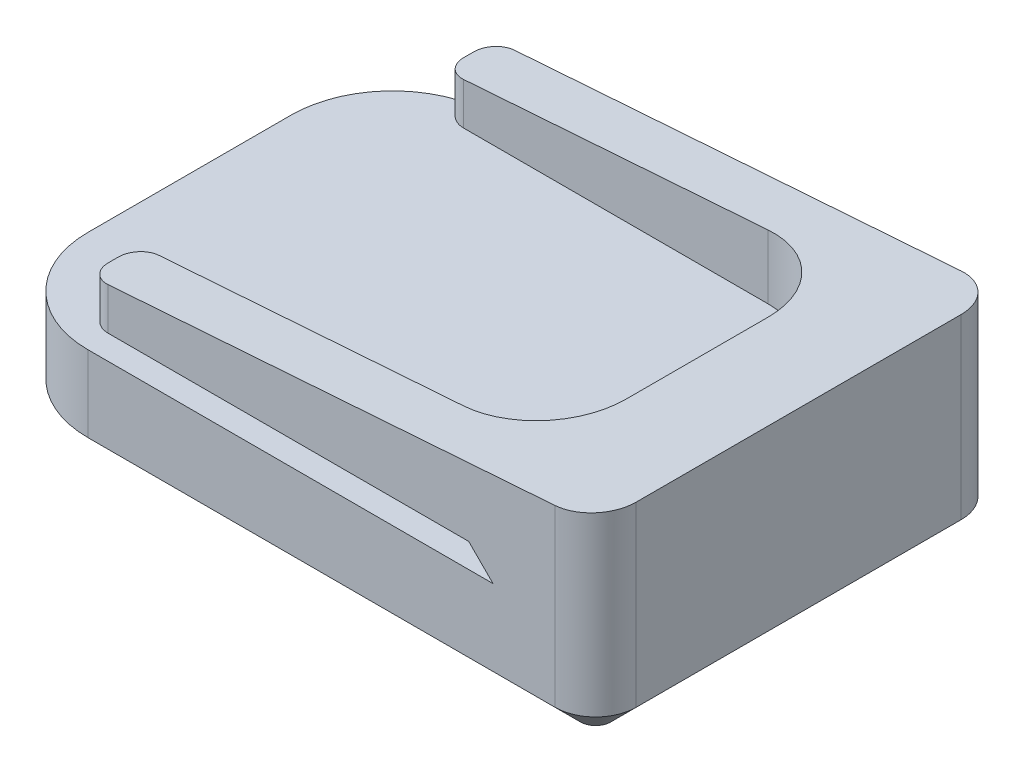
ISO-10303-21;
HEADER;
FILE_DESCRIPTION(('STEP AP214'),'2;1');
FILE_NAME('part.step','',(''),(''),'','','');
FILE_SCHEMA(('AUTOMOTIVE_DESIGN { 1 0 10303 214 1 1 1 1 }'));
ENDSEC;
DATA;
#1=APPLICATION_CONTEXT('core data for automotive mechanical design processes');
#2=APPLICATION_PROTOCOL_DEFINITION('international standard','automotive_design',2000,#1);
#3=PRODUCT_CONTEXT('',#1,'mechanical');
#4=PRODUCT('Part','Part','',(#3));
#5=PRODUCT_RELATED_PRODUCT_CATEGORY('part','',(#4));
#6=PRODUCT_DEFINITION_FORMATION('','',#4);
#7=PRODUCT_DEFINITION_CONTEXT('part definition',#1,'design');
#8=PRODUCT_DEFINITION('design','',#6,#7);
#9=PRODUCT_DEFINITION_SHAPE('','',#8);
#10=(LENGTH_UNIT() NAMED_UNIT(*) SI_UNIT(.MILLI.,.METRE.));
#11=(NAMED_UNIT(*) PLANE_ANGLE_UNIT() SI_UNIT($,.RADIAN.));
#12=(NAMED_UNIT(*) SI_UNIT($,.STERADIAN.) SOLID_ANGLE_UNIT());
#13=UNCERTAINTY_MEASURE_WITH_UNIT(LENGTH_MEASURE(1.E-05),#10,'distance_accuracy_value','');
#14=(GEOMETRIC_REPRESENTATION_CONTEXT(3) GLOBAL_UNCERTAINTY_ASSIGNED_CONTEXT((#13)) GLOBAL_UNIT_ASSIGNED_CONTEXT((#10,
#11,#12)) REPRESENTATION_CONTEXT('',''));
#15=CARTESIAN_POINT('',(0.,0.,0.));
#16=DIRECTION('',(0.,0.,1.));
#17=DIRECTION('',(1.,0.,0.));
#18=AXIS2_PLACEMENT_3D('',#15,#16,#17);
#19=CARTESIAN_POINT('',(-12.7,12.7,6.35));
#20=DIRECTION('',(0.,-1.,0.));
#21=DIRECTION('',(0.,0.,-1.));
#22=AXIS2_PLACEMENT_3D('',#19,#20,#21);
#23=CYLINDRICAL_SURFACE('',#22,6.35);
#24=DIRECTION('',(0.,-1.,0.));
#25=VECTOR('',#24,1.);
#26=CARTESIAN_POINT('',(-19.05,12.7,6.35));
#27=LINE('',#26,#25);
#28=CARTESIAN_POINT('',(-19.05,6.35,6.35));
#29=VERTEX_POINT('',#28);
#30=CARTESIAN_POINT('',(-19.05,1.5875,6.35));
#31=VERTEX_POINT('',#30);
#32=EDGE_CURVE('E447',#29,#31,#27,.T.);
#33=ORIENTED_EDGE('',*,*,#32,.T.);
#34=CARTESIAN_POINT('',(-12.7,1.5875,6.35));
#35=DIRECTION('',(0.,-1.,0.));
#36=DIRECTION('',(0.,0.,-1.));
#37=AXIS2_PLACEMENT_3D('',#34,#35,#36);
#38=CIRCLE('',#37,6.35);
#39=CARTESIAN_POINT('',(-12.7,1.5875,12.7));
#40=VERTEX_POINT('',#39);
#41=EDGE_CURVE('E301',#31,#40,#38,.F.);
#42=ORIENTED_EDGE('',*,*,#41,.T.);
#43=DIRECTION('',(0.,-1.,0.));
#44=VECTOR('',#43,1.);
#45=CARTESIAN_POINT('',(-12.7,12.7,12.7));
#46=LINE('',#45,#44);
#47=CARTESIAN_POINT('',(-12.7,6.35,12.7));
#48=VERTEX_POINT('',#47);
#49=EDGE_CURVE('E256',#48,#40,#46,.T.);
#50=ORIENTED_EDGE('',*,*,#49,.F.);
#51=CARTESIAN_POINT('',(-12.7,6.35,6.35));
#52=DIRECTION('',(0.,-1.,0.));
#53=DIRECTION('',(0.,0.,-1.));
#54=AXIS2_PLACEMENT_3D('',#51,#52,#53);
#55=CIRCLE('',#54,6.35);
#56=EDGE_CURVE('E411',#48,#29,#55,.T.);
#57=ORIENTED_EDGE('',*,*,#56,.T.);
#58=EDGE_LOOP('',(#33,#42,#50,#57));
#59=FACE_BOUND('',#58,.T.);
#60=ADVANCED_FACE('F43',(#59),#23,.T.);
#61=CARTESIAN_POINT('',(-12.7,12.7,12.7));
#62=DIRECTION('',(0.,0.,-1.));
#63=DIRECTION('',(-1.,0.,0.));
#64=AXIS2_PLACEMENT_3D('',#61,#62,#63);
#65=PLANE('',#64);
#66=DIRECTION('',(0.997418034356914,0.0718140984736978,0.));
#67=VECTOR('',#66,1.);
#68=CARTESIAN_POINT('',(-12.7,10.414,12.7));
#69=LINE('',#68,#67);
#70=CARTESIAN_POINT('',(-11.43,10.50544,12.7));
#71=VERTEX_POINT('',#70);
#72=CARTESIAN_POINT('',(16.51,12.51712,12.7));
#73=VERTEX_POINT('',#72);
#74=EDGE_CURVE('E228',#71,#73,#69,.T.);
#75=ORIENTED_EDGE('',*,*,#74,.F.);
#76=DIRECTION('',(0.,1.,0.));
#77=VECTOR('',#76,1.);
#78=CARTESIAN_POINT('',(-11.43,12.7,12.7));
#79=LINE('',#78,#77);
#80=CARTESIAN_POINT('',(-11.43,7.874,12.7));
#81=VERTEX_POINT('',#80);
#82=EDGE_CURVE('E344',#71,#81,#79,.F.);
#83=ORIENTED_EDGE('',*,*,#82,.T.);
#84=DIRECTION('',(-1.,0.,0.));
#85=VECTOR('',#84,1.);
#86=CARTESIAN_POINT('',(12.065,7.874,12.7));
#87=LINE('',#86,#85);
#88=CARTESIAN_POINT('',(11.1125,7.874,12.7));
#89=VERTEX_POINT('',#88);
#90=EDGE_CURVE('E239',#89,#81,#87,.T.);
#91=ORIENTED_EDGE('',*,*,#90,.F.);
#92=DIRECTION('',(-0.707106781186551,0.707106781186544,0.));
#93=VECTOR('',#92,1.);
#94=CARTESIAN_POINT('',(-3.20675000000011,22.19325,12.7));
#95=LINE('',#94,#93);
#96=CARTESIAN_POINT('',(12.6365,6.35000000000001,12.7));
#97=VERTEX_POINT('',#96);
#98=EDGE_CURVE('E305',#89,#97,#95,.F.);
#99=ORIENTED_EDGE('',*,*,#98,.T.);
#100=DIRECTION('',(1.,0.,0.));
#101=VECTOR('',#100,1.);
#102=CARTESIAN_POINT('',(-19.05,6.35,12.7));
#103=LINE('',#102,#101);
#104=EDGE_CURVE('E238',#48,#97,#103,.T.);
#105=ORIENTED_EDGE('',*,*,#104,.F.);
#106=ORIENTED_EDGE('',*,*,#49,.T.);
#107=DIRECTION('',(1.,0.,0.));
#108=VECTOR('',#107,1.);
#109=CARTESIAN_POINT('',(16.51,1.5875,12.7));
#110=LINE('',#109,#108);
#111=CARTESIAN_POINT('',(16.51,1.5875,12.7));
#112=VERTEX_POINT('',#111);
#113=EDGE_CURVE('E255',#40,#112,#110,.T.);
#114=ORIENTED_EDGE('',*,*,#113,.T.);
#115=DIRECTION('',(0.,-1.,0.));
#116=VECTOR('',#115,1.);
#117=CARTESIAN_POINT('',(16.51,12.7,12.7));
#118=LINE('',#117,#116);
#119=EDGE_CURVE('E244',#73,#112,#118,.T.);
#120=ORIENTED_EDGE('',*,*,#119,.F.);
#121=EDGE_LOOP('',(#75,#83,#91,#99,#105,#106,#114,#120));
#122=FACE_BOUND('',#121,.T.);
#123=ADVANCED_FACE('F252',(#122),#65,.F.);
#124=CARTESIAN_POINT('',(16.51,12.7,10.16));
#125=DIRECTION('',(0.,-1.,0.));
#126=DIRECTION('',(0.,0.,-1.));
#127=AXIS2_PLACEMENT_3D('',#124,#125,#126);
#128=CYLINDRICAL_SURFACE('',#127,2.54);
#129=ORIENTED_EDGE('',*,*,#119,.T.);
#130=CARTESIAN_POINT('',(16.51,1.5875,10.16));
#131=DIRECTION('',(0.,-1.,0.));
#132=DIRECTION('',(0.,0.,-1.));
#133=AXIS2_PLACEMENT_3D('',#130,#131,#132);
#134=CIRCLE('',#133,2.54);
#135=CARTESIAN_POINT('',(19.05,1.5875,10.16));
#136=VERTEX_POINT('',#135);
#137=EDGE_CURVE('E296',#112,#136,#134,.F.);
#138=ORIENTED_EDGE('',*,*,#137,.T.);
#139=DIRECTION('',(0.,-1.,0.));
#140=VECTOR('',#139,1.);
#141=CARTESIAN_POINT('',(19.05,12.7,10.16));
#142=LINE('',#141,#140);
#143=CARTESIAN_POINT('',(19.05,12.7,10.16));
#144=VERTEX_POINT('',#143);
#145=EDGE_CURVE('E247',#144,#136,#142,.T.);
#146=ORIENTED_EDGE('',*,*,#145,.F.);
#147=CARTESIAN_POINT('',(16.51,12.51712,10.16));
#148=DIRECTION('',(0.0718140984736978,-0.997418034356914,0.));
#149=DIRECTION('',(-0.997418034356914,-0.0718140984736978,0.));
#150=AXIS2_PLACEMENT_3D('',#147,#148,#149);
#151=ELLIPSE('',#150,2.54657516959544,2.54);
#152=EDGE_CURVE('E232',#144,#73,#151,.T.);
#153=ORIENTED_EDGE('',*,*,#152,.T.);
#154=EDGE_LOOP('',(#129,#138,#146,#153));
#155=FACE_BOUND('',#154,.T.);
#156=ADVANCED_FACE('F243',(#155),#128,.T.);
#157=CARTESIAN_POINT('',(19.05,12.7,10.16));
#158=DIRECTION('',(-1.,0.,0.));
#159=DIRECTION('',(0.,0.,1.));
#160=AXIS2_PLACEMENT_3D('',#157,#158,#159);
#161=PLANE('',#160);
#162=ORIENTED_EDGE('',*,*,#145,.T.);
#163=DIRECTION('',(0.,0.,-1.));
#164=VECTOR('',#163,1.);
#165=CARTESIAN_POINT('',(19.05,1.5875,-10.16));
#166=LINE('',#165,#164);
#167=CARTESIAN_POINT('',(19.05,1.5875,-10.16));
#168=VERTEX_POINT('',#167);
#169=EDGE_CURVE('E292',#136,#168,#166,.T.);
#170=ORIENTED_EDGE('',*,*,#169,.T.);
#171=DIRECTION('',(0.,-1.,0.));
#172=VECTOR('',#171,1.);
#173=CARTESIAN_POINT('',(19.05,12.7,-10.16));
#174=LINE('',#173,#172);
#175=CARTESIAN_POINT('',(19.05,12.7,-10.16));
#176=VERTEX_POINT('',#175);
#177=EDGE_CURVE('E260',#176,#168,#174,.T.);
#178=ORIENTED_EDGE('',*,*,#177,.F.);
#179=DIRECTION('',(0.,0.,-1.));
#180=VECTOR('',#179,1.);
#181=CARTESIAN_POINT('',(19.05,12.7,10.16));
#182=LINE('',#181,#180);
#183=EDGE_CURVE('E445',#144,#176,#182,.T.);
#184=ORIENTED_EDGE('',*,*,#183,.F.);
#185=EDGE_LOOP('',(#162,#170,#178,#184));
#186=FACE_BOUND('',#185,.T.);
#187=ADVANCED_FACE('F543',(#186),#161,.F.);
#188=CARTESIAN_POINT('',(16.51,12.7,-10.16));
#189=DIRECTION('',(0.,-1.,0.));
#190=DIRECTION('',(0.,0.,-1.));
#191=AXIS2_PLACEMENT_3D('',#188,#189,#190);
#192=CYLINDRICAL_SURFACE('',#191,2.54);
#193=ORIENTED_EDGE('',*,*,#177,.T.);
#194=CARTESIAN_POINT('',(16.51,1.5875,-10.16));
#195=DIRECTION('',(0.,-1.,0.));
#196=DIRECTION('',(0.,0.,-1.));
#197=AXIS2_PLACEMENT_3D('',#194,#195,#196);
#198=CIRCLE('',#197,2.54);
#199=CARTESIAN_POINT('',(16.51,1.5875,-12.7));
#200=VERTEX_POINT('',#199);
#201=EDGE_CURVE('E294',#168,#200,#198,.F.);
#202=ORIENTED_EDGE('',*,*,#201,.T.);
#203=DIRECTION('',(0.,-1.,0.));
#204=VECTOR('',#203,1.);
#205=CARTESIAN_POINT('',(16.51,12.7,-12.7));
#206=LINE('',#205,#204);
#207=CARTESIAN_POINT('',(16.51,12.51712,-12.7));
#208=VERTEX_POINT('',#207);
#209=EDGE_CURVE('E456',#208,#200,#206,.T.);
#210=ORIENTED_EDGE('',*,*,#209,.F.);
#211=CARTESIAN_POINT('',(16.51,12.51712,-10.16));
#212=DIRECTION('',(0.0718140984736978,-0.997418034356914,0.));
#213=DIRECTION('',(-0.997418034356914,-0.0718140984736978,0.));
#214=AXIS2_PLACEMENT_3D('',#211,#212,#213);
#215=ELLIPSE('',#214,2.54657516959543,2.54);
#216=EDGE_CURVE('E250',#208,#176,#215,.T.);
#217=ORIENTED_EDGE('',*,*,#216,.T.);
#218=EDGE_LOOP('',(#193,#202,#210,#217));
#219=FACE_BOUND('',#218,.T.);
#220=ADVANCED_FACE('F462',(#219),#192,.T.);
#221=CARTESIAN_POINT('',(-12.7,12.7,-12.7));
#222=DIRECTION('',(0.,0.,1.));
#223=DIRECTION('',(1.,0.,0.));
#224=AXIS2_PLACEMENT_3D('',#221,#222,#223);
#225=PLANE('',#224);
#226=DIRECTION('',(-1.,0.,0.));
#227=VECTOR('',#226,1.);
#228=CARTESIAN_POINT('',(12.7,7.874,-12.7));
#229=LINE('',#228,#227);
#230=CARTESIAN_POINT('',(11.1125,7.874,-12.7));
#231=VERTEX_POINT('',#230);
#232=CARTESIAN_POINT('',(-11.43,7.874,-12.7));
#233=VERTEX_POINT('',#232);
#234=EDGE_CURVE('E416',#231,#233,#229,.T.);
#235=ORIENTED_EDGE('',*,*,#234,.T.);
#236=DIRECTION('',(0.,1.,0.));
#237=VECTOR('',#236,1.);
#238=CARTESIAN_POINT('',(-11.43,12.7,-12.7));
#239=LINE('',#238,#237);
#240=CARTESIAN_POINT('',(-11.43,10.50544,-12.7));
#241=VERTEX_POINT('',#240);
#242=EDGE_CURVE('E365',#233,#241,#239,.T.);
#243=ORIENTED_EDGE('',*,*,#242,.T.);
#244=DIRECTION('',(0.997418034356914,0.0718140984736978,0.));
#245=VECTOR('',#244,1.);
#246=CARTESIAN_POINT('',(-12.7,10.414,-12.7));
#247=LINE('',#246,#245);
#248=EDGE_CURVE('E519',#241,#208,#247,.T.);
#249=ORIENTED_EDGE('',*,*,#248,.T.);
#250=ORIENTED_EDGE('',*,*,#209,.T.);
#251=DIRECTION('',(-1.,0.,0.));
#252=VECTOR('',#251,1.);
#253=CARTESIAN_POINT('',(-12.7,1.58750000000001,-12.7));
#254=LINE('',#253,#252);
#255=CARTESIAN_POINT('',(-12.7,1.5875,-12.7));
#256=VERTEX_POINT('',#255);
#257=EDGE_CURVE('E272',#200,#256,#254,.T.);
#258=ORIENTED_EDGE('',*,*,#257,.T.);
#259=DIRECTION('',(0.,-1.,0.));
#260=VECTOR('',#259,1.);
#261=CARTESIAN_POINT('',(-12.7,12.7,-12.7));
#262=LINE('',#261,#260);
#263=CARTESIAN_POINT('',(-12.7,6.35000000000001,-12.7));
#264=VERTEX_POINT('',#263);
#265=EDGE_CURVE('E453',#264,#256,#262,.T.);
#266=ORIENTED_EDGE('',*,*,#265,.F.);
#267=DIRECTION('',(1.,0.,0.));
#268=VECTOR('',#267,1.);
#269=CARTESIAN_POINT('',(12.065,6.35000000000001,-12.7));
#270=LINE('',#269,#268);
#271=CARTESIAN_POINT('',(12.6365,6.35000000000001,-12.7));
#272=VERTEX_POINT('',#271);
#273=EDGE_CURVE('E413',#264,#272,#270,.T.);
#274=ORIENTED_EDGE('',*,*,#273,.T.);
#275=DIRECTION('',(0.707106781186551,-0.707106781186544,0.));
#276=VECTOR('',#275,1.);
#277=CARTESIAN_POINT('',(-3.20675000000011,22.19325,-12.7));
#278=LINE('',#277,#276);
#279=EDGE_CURVE('E307',#272,#231,#278,.F.);
#280=ORIENTED_EDGE('',*,*,#279,.T.);
#281=EDGE_LOOP('',(#235,#243,#249,#250,#258,#266,#274,#280));
#282=FACE_BOUND('',#281,.T.);
#283=ADVANCED_FACE('F484',(#282),#225,.F.);
#284=CARTESIAN_POINT('',(-12.7,12.7,-6.34999999999999));
#285=DIRECTION('',(0.,-1.,0.));
#286=DIRECTION('',(0.,0.,-1.));
#287=AXIS2_PLACEMENT_3D('',#284,#285,#286);
#288=CYLINDRICAL_SURFACE('',#287,6.35);
#289=ORIENTED_EDGE('',*,*,#265,.T.);
#290=CARTESIAN_POINT('',(-12.7,1.5875,-6.34999999999999));
#291=DIRECTION('',(0.,-1.,0.));
#292=DIRECTION('',(0.,0.,-1.));
#293=AXIS2_PLACEMENT_3D('',#290,#291,#292);
#294=CIRCLE('',#293,6.35);
#295=CARTESIAN_POINT('',(-19.05,1.5875,-6.34999999999999));
#296=VERTEX_POINT('',#295);
#297=EDGE_CURVE('E299',#256,#296,#294,.F.);
#298=ORIENTED_EDGE('',*,*,#297,.T.);
#299=DIRECTION('',(0.,-1.,0.));
#300=VECTOR('',#299,1.);
#301=CARTESIAN_POINT('',(-19.05,12.7,-6.34999999999999));
#302=LINE('',#301,#300);
#303=CARTESIAN_POINT('',(-19.05,6.35,-6.34999999999999));
#304=VERTEX_POINT('',#303);
#305=EDGE_CURVE('E450',#304,#296,#302,.T.);
#306=ORIENTED_EDGE('',*,*,#305,.F.);
#307=CARTESIAN_POINT('',(-12.7,6.35,-6.34999999999999));
#308=DIRECTION('',(0.,-1.,0.));
#309=DIRECTION('',(0.,0.,-1.));
#310=AXIS2_PLACEMENT_3D('',#307,#308,#309);
#311=CIRCLE('',#310,6.35);
#312=EDGE_CURVE('E441',#304,#264,#311,.T.);
#313=ORIENTED_EDGE('',*,*,#312,.T.);
#314=EDGE_LOOP('',(#289,#298,#306,#313));
#315=FACE_BOUND('',#314,.T.);
#316=ADVANCED_FACE('F486',(#315),#288,.T.);
#317=CARTESIAN_POINT('',(-19.05,12.7,6.35));
#318=DIRECTION('',(1.,0.,0.));
#319=DIRECTION('',(0.,0.,-1.));
#320=AXIS2_PLACEMENT_3D('',#317,#318,#319);
#321=PLANE('',#320);
#322=ORIENTED_EDGE('',*,*,#305,.T.);
#323=DIRECTION('',(0.,0.,1.));
#324=VECTOR('',#323,1.);
#325=CARTESIAN_POINT('',(-19.05,1.5875,6.35));
#326=LINE('',#325,#324);
#327=EDGE_CURVE('E303',#296,#31,#326,.T.);
#328=ORIENTED_EDGE('',*,*,#327,.T.);
#329=ORIENTED_EDGE('',*,*,#32,.F.);
#330=DIRECTION('',(0.,0.,1.));
#331=VECTOR('',#330,1.);
#332=CARTESIAN_POINT('',(-19.05,6.35,-9.525));
#333=LINE('',#332,#331);
#334=EDGE_CURVE('E249',#304,#29,#333,.T.);
#335=ORIENTED_EDGE('',*,*,#334,.F.);
#336=EDGE_LOOP('',(#322,#328,#329,#335));
#337=FACE_BOUND('',#336,.T.);
#338=ADVANCED_FACE('F858',(#337),#321,.F.);
#339=CARTESIAN_POINT('',(-12.7,0.,6.35));
#340=DIRECTION('',(0.,-1.,0.));
#341=DIRECTION('',(0.,0.,-1.));
#342=AXIS2_PLACEMENT_3D('',#339,#340,#341);
#343=PLANE('',#342);
#344=DIRECTION('',(1.,0.,0.));
#345=VECTOR('',#344,1.);
#346=CARTESIAN_POINT('',(16.51,0.,-11.1125));
#347=LINE('',#346,#345);
#348=CARTESIAN_POINT('',(-12.7,0.,-11.1125));
#349=VERTEX_POINT('',#348);
#350=CARTESIAN_POINT('',(16.51,0.,-11.1125));
#351=VERTEX_POINT('',#350);
#352=EDGE_CURVE('E287',#349,#351,#347,.T.);
#353=ORIENTED_EDGE('',*,*,#352,.T.);
#354=CARTESIAN_POINT('',(16.51,0.,-10.16));
#355=DIRECTION('',(0.,-1.,0.));
#356=DIRECTION('',(0.,0.,-1.));
#357=AXIS2_PLACEMENT_3D('',#354,#355,#356);
#358=CIRCLE('',#357,0.952499999999998);
#359=CARTESIAN_POINT('',(17.4625,0.,-10.16));
#360=VERTEX_POINT('',#359);
#361=EDGE_CURVE('E290',#351,#360,#358,.T.);
#362=ORIENTED_EDGE('',*,*,#361,.T.);
#363=DIRECTION('',(0.,0.,1.));
#364=VECTOR('',#363,1.);
#365=CARTESIAN_POINT('',(17.4625,0.,10.16));
#366=LINE('',#365,#364);
#367=CARTESIAN_POINT('',(17.4625,0.,10.16));
#368=VERTEX_POINT('',#367);
#369=EDGE_CURVE('E285',#360,#368,#366,.T.);
#370=ORIENTED_EDGE('',*,*,#369,.T.);
#371=CARTESIAN_POINT('',(16.51,0.,10.16));
#372=DIRECTION('',(0.,-1.,0.));
#373=DIRECTION('',(0.,0.,-1.));
#374=AXIS2_PLACEMENT_3D('',#371,#372,#373);
#375=CIRCLE('',#374,0.952499999999998);
#376=CARTESIAN_POINT('',(16.51,0.,11.1125));
#377=VERTEX_POINT('',#376);
#378=EDGE_CURVE('E283',#368,#377,#375,.T.);
#379=ORIENTED_EDGE('',*,*,#378,.T.);
#380=DIRECTION('',(-1.,0.,0.));
#381=VECTOR('',#380,1.);
#382=CARTESIAN_POINT('',(-12.7,0.,11.1125));
#383=LINE('',#382,#381);
#384=CARTESIAN_POINT('',(-12.7,0.,11.1125));
#385=VERTEX_POINT('',#384);
#386=EDGE_CURVE('E281',#377,#385,#383,.T.);
#387=ORIENTED_EDGE('',*,*,#386,.T.);
#388=CARTESIAN_POINT('',(-12.7,0.,6.35));
#389=DIRECTION('',(0.,-1.,0.));
#390=DIRECTION('',(0.,0.,-1.));
#391=AXIS2_PLACEMENT_3D('',#388,#389,#390);
#392=CIRCLE('',#391,4.7625);
#393=CARTESIAN_POINT('',(-17.4625,0.,6.35));
#394=VERTEX_POINT('',#393);
#395=EDGE_CURVE('E277',#385,#394,#392,.T.);
#396=ORIENTED_EDGE('',*,*,#395,.T.);
#397=DIRECTION('',(0.,0.,-1.));
#398=VECTOR('',#397,1.);
#399=CARTESIAN_POINT('',(-17.4625,0.,-6.34999999999999));
#400=LINE('',#399,#398);
#401=CARTESIAN_POINT('',(-17.4625,0.,-6.34999999999999));
#402=VERTEX_POINT('',#401);
#403=EDGE_CURVE('E275',#394,#402,#400,.T.);
#404=ORIENTED_EDGE('',*,*,#403,.T.);
#405=CARTESIAN_POINT('',(-12.7,0.,-6.34999999999999));
#406=DIRECTION('',(0.,-1.,0.));
#407=DIRECTION('',(0.,0.,-1.));
#408=AXIS2_PLACEMENT_3D('',#405,#406,#407);
#409=CIRCLE('',#408,4.7625);
#410=EDGE_CURVE('E279',#402,#349,#409,.T.);
#411=ORIENTED_EDGE('',*,*,#410,.T.);
#412=EDGE_LOOP('',(#353,#362,#370,#379,#387,#396,#404,#411));
#413=FACE_BOUND('',#412,.T.);
#414=ADVANCED_FACE('F551',(#413),#343,.T.);
#415=CARTESIAN_POINT('',(12.7,6.35,-9.525));
#416=DIRECTION('',(0.,-1.,0.));
#417=DIRECTION('',(0.,0.,-1.));
#418=AXIS2_PLACEMENT_3D('',#415,#416,#417);
#419=PLANE('',#418);
#420=CARTESIAN_POINT('',(7.62000000000003,6.35,-4.445));
#421=DIRECTION('',(0.,-1.,0.));
#422=DIRECTION('',(0.,0.,-1.));
#423=AXIS2_PLACEMENT_3D('',#420,#421,#422);
#424=CIRCLE('',#423,5.08);
#425=CARTESIAN_POINT('',(12.7,6.35,-4.445));
#426=VERTEX_POINT('',#425);
#427=CARTESIAN_POINT('',(12.6365,6.35,-5.24570453352144));
#428=VERTEX_POINT('',#427);
#429=EDGE_CURVE('E376',#426,#428,#424,.F.);
#430=ORIENTED_EDGE('',*,*,#429,.T.);
#431=DIRECTION('',(0.,0.,1.));
#432=VECTOR('',#431,1.);
#433=CARTESIAN_POINT('',(12.6365,6.35,-12.7));
#434=LINE('',#433,#432);
#435=EDGE_CURVE('E267',#428,#272,#434,.F.);
#436=ORIENTED_EDGE('',*,*,#435,.T.);
#437=ORIENTED_EDGE('',*,*,#273,.F.);
#438=ORIENTED_EDGE('',*,*,#312,.F.);
#439=ORIENTED_EDGE('',*,*,#334,.T.);
#440=ORIENTED_EDGE('',*,*,#56,.F.);
#441=ORIENTED_EDGE('',*,*,#104,.T.);
#442=DIRECTION('',(0.,0.,1.));
#443=VECTOR('',#442,1.);
#444=CARTESIAN_POINT('',(12.6365,6.35,-12.7));
#445=LINE('',#444,#443);
#446=CARTESIAN_POINT('',(12.6365,6.35,5.24570453352145));
#447=VERTEX_POINT('',#446);
#448=EDGE_CURVE('E269',#97,#447,#445,.F.);
#449=ORIENTED_EDGE('',*,*,#448,.T.);
#450=CARTESIAN_POINT('',(7.62000000000003,6.35,4.445));
#451=DIRECTION('',(0.,-1.,0.));
#452=DIRECTION('',(0.,0.,-1.));
#453=AXIS2_PLACEMENT_3D('',#450,#451,#452);
#454=CIRCLE('',#453,5.08);
#455=CARTESIAN_POINT('',(12.7,6.35,4.44499999999999));
#456=VERTEX_POINT('',#455);
#457=EDGE_CURVE('E374',#447,#456,#454,.F.);
#458=ORIENTED_EDGE('',*,*,#457,.T.);
#459=DIRECTION('',(0.,0.,1.));
#460=VECTOR('',#459,1.);
#461=CARTESIAN_POINT('',(12.7,6.35,-9.525));
#462=LINE('',#461,#460);
#463=EDGE_CURVE('E439',#426,#456,#462,.T.);
#464=ORIENTED_EDGE('',*,*,#463,.F.);
#465=EDGE_LOOP('',(#430,#436,#437,#438,#439,#440,#441,#449,#458,#464));
#466=FACE_BOUND('',#465,.T.);
#467=ADVANCED_FACE('F406',(#466),#419,.F.);
#468=CARTESIAN_POINT('',(12.7,12.7,9.52499999999998));
#469=DIRECTION('',(0.,0.,1.));
#470=DIRECTION('',(0.,-1.,0.));
#471=AXIS2_PLACEMENT_3D('',#468,#469,#470);
#472=PLANE('',#471);
#473=DIRECTION('',(0.997418034356914,0.0718140984736978,0.));
#474=VECTOR('',#473,1.);
#475=CARTESIAN_POINT('',(12.7327486310964,12.2451579014389,9.52499999999998));
#476=LINE('',#475,#474);
#477=CARTESIAN_POINT('',(-11.43,10.50544,9.52499999999998));
#478=VERTEX_POINT('',#477);
#479=CARTESIAN_POINT('',(7.62000000000003,11.87704,9.52499999999998));
#480=VERTEX_POINT('',#479);
#481=EDGE_CURVE('E434',#478,#480,#476,.T.);
#482=ORIENTED_EDGE('',*,*,#481,.T.);
#483=DIRECTION('',(0.,1.,0.));
#484=VECTOR('',#483,1.);
#485=CARTESIAN_POINT('',(7.62000000000003,6.35,9.525));
#486=LINE('',#485,#484);
#487=CARTESIAN_POINT('',(7.62000000000003,7.874,9.52499999999999));
#488=VERTEX_POINT('',#487);
#489=EDGE_CURVE('E381',#480,#488,#486,.F.);
#490=ORIENTED_EDGE('',*,*,#489,.T.);
#491=DIRECTION('',(-1.,0.,0.));
#492=VECTOR('',#491,1.);
#493=CARTESIAN_POINT('',(12.7,7.874,9.52499999999999));
#494=LINE('',#493,#492);
#495=CARTESIAN_POINT('',(-11.43,7.874,9.52499999999999));
#496=VERTEX_POINT('',#495);
#497=EDGE_CURVE('E397',#488,#496,#494,.T.);
#498=ORIENTED_EDGE('',*,*,#497,.T.);
#499=DIRECTION('',(0.,1.,0.));
#500=VECTOR('',#499,1.);
#501=CARTESIAN_POINT('',(-11.43,12.7,9.52499999999998));
#502=LINE('',#501,#500);
#503=EDGE_CURVE('E351',#496,#478,#502,.T.);
#504=ORIENTED_EDGE('',*,*,#503,.T.);
#505=EDGE_LOOP('',(#482,#490,#498,#504));
#506=FACE_BOUND('',#505,.T.);
#507=ADVANCED_FACE('F538',(#506),#472,.F.);
#508=CARTESIAN_POINT('',(12.7,6.35,-9.525));
#509=DIRECTION('',(0.,0.,-1.));
#510=DIRECTION('',(0.,1.,0.));
#511=AXIS2_PLACEMENT_3D('',#508,#509,#510);
#512=PLANE('',#511);
#513=DIRECTION('',(1.,0.,0.));
#514=VECTOR('',#513,1.);
#515=CARTESIAN_POINT('',(12.7,7.874,-9.525));
#516=LINE('',#515,#514);
#517=CARTESIAN_POINT('',(-11.43,7.874,-9.525));
#518=VERTEX_POINT('',#517);
#519=CARTESIAN_POINT('',(7.62000000000003,7.874,-9.525));
#520=VERTEX_POINT('',#519);
#521=EDGE_CURVE('E423',#518,#520,#516,.T.);
#522=ORIENTED_EDGE('',*,*,#521,.T.);
#523=DIRECTION('',(0.,-1.,0.));
#524=VECTOR('',#523,1.);
#525=CARTESIAN_POINT('',(7.62000000000003,12.2428,-9.52499999999998));
#526=LINE('',#525,#524);
#527=CARTESIAN_POINT('',(7.62000000000003,11.87704,-9.52499999999998));
#528=VERTEX_POINT('',#527);
#529=EDGE_CURVE('E379',#520,#528,#526,.F.);
#530=ORIENTED_EDGE('',*,*,#529,.T.);
#531=DIRECTION('',(-0.997418034356914,-0.0718140984736978,0.));
#532=VECTOR('',#531,1.);
#533=CARTESIAN_POINT('',(12.2779065325354,12.2124092703425,-9.52499999999998));
#534=LINE('',#533,#532);
#535=CARTESIAN_POINT('',(-11.43,10.50544,-9.52499999999998));
#536=VERTEX_POINT('',#535);
#537=EDGE_CURVE('E432',#528,#536,#534,.T.);
#538=ORIENTED_EDGE('',*,*,#537,.T.);
#539=DIRECTION('',(0.,-1.,0.));
#540=VECTOR('',#539,1.);
#541=CARTESIAN_POINT('',(-11.43,6.35,-9.525));
#542=LINE('',#541,#540);
#543=EDGE_CURVE('E354',#536,#518,#542,.T.);
#544=ORIENTED_EDGE('',*,*,#543,.T.);
#545=EDGE_LOOP('',(#522,#530,#538,#544));
#546=FACE_BOUND('',#545,.T.);
#547=ADVANCED_FACE('F502',(#546),#512,.F.);
#548=CARTESIAN_POINT('',(12.7,0.,0.));
#549=DIRECTION('',(1.,0.,0.));
#550=DIRECTION('',(0.,0.,-1.));
#551=AXIS2_PLACEMENT_3D('',#548,#549,#550);
#552=PLANE('',#551);
#553=DIRECTION('',(0.,0.,-1.));
#554=VECTOR('',#553,1.);
#555=CARTESIAN_POINT('',(12.7,12.2428,0.));
#556=LINE('',#555,#554);
#557=CARTESIAN_POINT('',(12.7,12.2428,4.44499999999998));
#558=VERTEX_POINT('',#557);
#559=CARTESIAN_POINT('',(12.7,12.2428,-4.44499999999998));
#560=VERTEX_POINT('',#559);
#561=EDGE_CURVE('E258',#558,#560,#556,.T.);
#562=ORIENTED_EDGE('',*,*,#561,.T.);
#563=DIRECTION('',(0.,-1.,0.));
#564=VECTOR('',#563,1.);
#565=CARTESIAN_POINT('',(12.7,6.34999999999998,-4.445));
#566=LINE('',#565,#564);
#567=EDGE_CURVE('E371',#560,#426,#566,.T.);
#568=ORIENTED_EDGE('',*,*,#567,.T.);
#569=ORIENTED_EDGE('',*,*,#463,.T.);
#570=DIRECTION('',(0.,1.,0.));
#571=VECTOR('',#570,1.);
#572=CARTESIAN_POINT('',(12.7,12.2428,4.44499999999998));
#573=LINE('',#572,#571);
#574=EDGE_CURVE('E368',#456,#558,#573,.T.);
#575=ORIENTED_EDGE('',*,*,#574,.T.);
#576=EDGE_LOOP('',(#562,#568,#569,#575));
#577=FACE_BOUND('',#576,.T.);
#578=ADVANCED_FACE('F541',(#577),#552,.F.);
#579=CARTESIAN_POINT('',(-12.7,7.874,-12.7));
#580=DIRECTION('',(1.,0.,0.));
#581=DIRECTION('',(0.,0.,-1.));
#582=AXIS2_PLACEMENT_3D('',#579,#580,#581);
#583=PLANE('',#582);
#584=DIRECTION('',(0.,0.,1.));
#585=VECTOR('',#584,1.);
#586=CARTESIAN_POINT('',(-12.7,7.874,-12.7));
#587=LINE('',#586,#585);
#588=CARTESIAN_POINT('',(-12.7,7.874,10.795));
#589=VERTEX_POINT('',#588);
#590=CARTESIAN_POINT('',(-12.7,7.874,11.43));
#591=VERTEX_POINT('',#590);
#592=EDGE_CURVE('E428',#589,#591,#587,.T.);
#593=ORIENTED_EDGE('',*,*,#592,.T.);
#594=DIRECTION('',(0.,1.,0.));
#595=VECTOR('',#594,1.);
#596=CARTESIAN_POINT('',(-12.7,7.874,11.43));
#597=LINE('',#596,#595);
#598=CARTESIAN_POINT('',(-12.7,10.414,11.43));
#599=VERTEX_POINT('',#598);
#600=EDGE_CURVE('E333',#591,#599,#597,.T.);
#601=ORIENTED_EDGE('',*,*,#600,.T.);
#602=DIRECTION('',(0.,0.,1.));
#603=VECTOR('',#602,1.);
#604=CARTESIAN_POINT('',(-12.7,10.414,-12.7));
#605=LINE('',#604,#603);
#606=CARTESIAN_POINT('',(-12.7,10.414,10.795));
#607=VERTEX_POINT('',#606);
#608=EDGE_CURVE('E424',#607,#599,#605,.T.);
#609=ORIENTED_EDGE('',*,*,#608,.F.);
#610=DIRECTION('',(0.,1.,0.));
#611=VECTOR('',#610,1.);
#612=CARTESIAN_POINT('',(-12.7,7.87400000000008,10.795));
#613=LINE('',#612,#611);
#614=EDGE_CURVE('E309',#607,#589,#613,.F.);
#615=ORIENTED_EDGE('',*,*,#614,.T.);
#616=EDGE_LOOP('',(#593,#601,#609,#615));
#617=FACE_BOUND('',#616,.T.);
#618=ADVANCED_FACE('F530',(#617),#583,.F.);
#619=CARTESIAN_POINT('',(-12.7,7.874,-11.43));
#620=VERTEX_POINT('',#619);
#621=CARTESIAN_POINT('',(-12.7,7.874,-10.795));
#622=VERTEX_POINT('',#621);
#623=EDGE_CURVE('E425',#620,#622,#587,.T.);
#624=ORIENTED_EDGE('',*,*,#623,.T.);
#625=DIRECTION('',(0.,-1.,0.));
#626=VECTOR('',#625,1.);
#627=CARTESIAN_POINT('',(-12.7,7.87399999999999,-10.795));
#628=LINE('',#627,#626);
#629=CARTESIAN_POINT('',(-12.7,10.414,-10.795));
#630=VERTEX_POINT('',#629);
#631=EDGE_CURVE('E363',#622,#630,#628,.F.);
#632=ORIENTED_EDGE('',*,*,#631,.T.);
#633=CARTESIAN_POINT('',(-12.7,10.414,-11.43));
#634=VERTEX_POINT('',#633);
#635=EDGE_CURVE('E420',#634,#630,#605,.T.);
#636=ORIENTED_EDGE('',*,*,#635,.F.);
#637=DIRECTION('',(0.,1.,0.));
#638=VECTOR('',#637,1.);
#639=CARTESIAN_POINT('',(-12.7,7.874,-11.43));
#640=LINE('',#639,#638);
#641=EDGE_CURVE('E361',#634,#620,#640,.F.);
#642=ORIENTED_EDGE('',*,*,#641,.T.);
#643=EDGE_LOOP('',(#624,#632,#636,#642));
#644=FACE_BOUND('',#643,.T.);
#645=ADVANCED_FACE('F512',(#644),#583,.F.);
#646=CARTESIAN_POINT('',(-12.7,10.414,-12.7));
#647=DIRECTION('',(0.0718140984736978,-0.997418034356914,0.));
#648=DIRECTION('',(0.997418034356914,0.0718140984736978,0.));
#649=AXIS2_PLACEMENT_3D('',#646,#647,#648);
#650=PLANE('',#649);
#651=ORIENTED_EDGE('',*,*,#608,.T.);
#652=CARTESIAN_POINT('',(-11.43,10.50544,11.43));
#653=DIRECTION('',(0.0718140984736978,-0.997418034356914,0.));
#654=DIRECTION('',(0.997418034356914,0.0718140984736978,0.));
#655=AXIS2_PLACEMENT_3D('',#652,#653,#654);
#656=ELLIPSE('',#655,1.27328758479772,1.27);
#657=EDGE_CURVE('E234',#599,#71,#656,.F.);
#658=ORIENTED_EDGE('',*,*,#657,.T.);
#659=ORIENTED_EDGE('',*,*,#74,.T.);
#660=ORIENTED_EDGE('',*,*,#152,.F.);
#661=ORIENTED_EDGE('',*,*,#183,.T.);
#662=ORIENTED_EDGE('',*,*,#216,.F.);
#663=ORIENTED_EDGE('',*,*,#248,.F.);
#664=CARTESIAN_POINT('',(-11.43,10.50544,-11.43));
#665=DIRECTION('',(0.0718140984736978,-0.997418034356914,0.));
#666=DIRECTION('',(0.997418034356914,0.0718140984736978,0.));
#667=AXIS2_PLACEMENT_3D('',#664,#665,#666);
#668=ELLIPSE('',#667,1.27328758479772,1.27);
#669=EDGE_CURVE('E336',#241,#634,#668,.F.);
#670=ORIENTED_EDGE('',*,*,#669,.T.);
#671=ORIENTED_EDGE('',*,*,#635,.T.);
#672=CARTESIAN_POINT('',(-11.43,10.50544,-10.795));
#673=DIRECTION('',(0.0718140984736978,-0.997418034356914,0.));
#674=DIRECTION('',(-0.997418034356914,-0.0718140984736978,0.));
#675=AXIS2_PLACEMENT_3D('',#672,#673,#674);
#676=ELLIPSE('',#675,1.27328758479772,1.27);
#677=EDGE_CURVE('E338',#630,#536,#676,.F.);
#678=ORIENTED_EDGE('',*,*,#677,.T.);
#679=ORIENTED_EDGE('',*,*,#537,.F.);
#680=CARTESIAN_POINT('',(7.62000000000003,11.87704,-4.44499999999998));
#681=DIRECTION('',(0.0718140984736978,-0.997418034356914,0.));
#682=DIRECTION('',(0.997418034356914,0.0718140984736978,0.));
#683=AXIS2_PLACEMENT_3D('',#680,#681,#682);
#684=ELLIPSE('',#683,5.09315033919086,5.08);
#685=EDGE_CURVE('E387',#528,#560,#684,.T.);
#686=ORIENTED_EDGE('',*,*,#685,.T.);
#687=ORIENTED_EDGE('',*,*,#561,.F.);
#688=CARTESIAN_POINT('',(7.62000000000003,11.87704,4.44499999999998));
#689=DIRECTION('',(0.0718140984736978,-0.997418034356914,0.));
#690=DIRECTION('',(-0.997418034356914,-0.0718140984736978,0.));
#691=AXIS2_PLACEMENT_3D('',#688,#689,#690);
#692=ELLIPSE('',#691,5.09315033919086,5.08);
#693=EDGE_CURVE('E389',#558,#480,#692,.T.);
#694=ORIENTED_EDGE('',*,*,#693,.T.);
#695=ORIENTED_EDGE('',*,*,#481,.F.);
#696=CARTESIAN_POINT('',(-11.43,10.50544,10.795));
#697=DIRECTION('',(0.0718140984736978,-0.997418034356914,0.));
#698=DIRECTION('',(0.997418034356914,0.0718140984736978,0.));
#699=AXIS2_PLACEMENT_3D('',#696,#697,#698);
#700=ELLIPSE('',#699,1.27328758479772,1.27);
#701=EDGE_CURVE('E341',#478,#607,#700,.F.);
#702=ORIENTED_EDGE('',*,*,#701,.T.);
#703=EDGE_LOOP('',(#651,#658,#659,#660,#661,#662,#663,#670,#671,#678,#679,#686,#687,#694,#695,#702));
#704=FACE_BOUND('',#703,.T.);
#705=ADVANCED_FACE('F231',(#704),#650,.F.);
#706=CARTESIAN_POINT('',(12.065,7.874,-12.7));
#707=DIRECTION('',(0.,1.,0.));
#708=DIRECTION('',(-1.,0.,0.));
#709=AXIS2_PLACEMENT_3D('',#706,#707,#708);
#710=PLANE('',#709);
#711=ORIENTED_EDGE('',*,*,#90,.T.);
#712=CARTESIAN_POINT('',(-11.43,7.874,11.43));
#713=DIRECTION('',(0.,1.,0.));
#714=DIRECTION('',(-1.,0.,0.));
#715=AXIS2_PLACEMENT_3D('',#712,#713,#714);
#716=CIRCLE('',#715,1.27);
#717=EDGE_CURVE('E349',#81,#591,#716,.F.);
#718=ORIENTED_EDGE('',*,*,#717,.T.);
#719=ORIENTED_EDGE('',*,*,#592,.F.);
#720=CARTESIAN_POINT('',(-11.43,7.874,10.795));
#721=DIRECTION('',(0.,1.,0.));
#722=DIRECTION('',(-1.,0.,0.));
#723=AXIS2_PLACEMENT_3D('',#720,#721,#722);
#724=CIRCLE('',#723,1.27);
#725=EDGE_CURVE('E346',#589,#496,#724,.F.);
#726=ORIENTED_EDGE('',*,*,#725,.T.);
#727=ORIENTED_EDGE('',*,*,#497,.F.);
#728=CARTESIAN_POINT('',(7.62000000000003,7.874,4.44499999999999));
#729=DIRECTION('',(0.,1.,0.));
#730=DIRECTION('',(-1.,0.,0.));
#731=AXIS2_PLACEMENT_3D('',#728,#729,#730);
#732=CIRCLE('',#731,5.08);
#733=CARTESIAN_POINT('',(11.1125,7.874,8.13401663726258));
#734=VERTEX_POINT('',#733);
#735=EDGE_CURVE('E51',#488,#734,#732,.T.);
#736=ORIENTED_EDGE('',*,*,#735,.T.);
#737=DIRECTION('',(0.,0.,1.));
#738=VECTOR('',#737,1.);
#739=CARTESIAN_POINT('',(11.1125,7.874,12.7));
#740=LINE('',#739,#738);
#741=EDGE_CURVE('E57',#734,#89,#740,.T.);
#742=ORIENTED_EDGE('',*,*,#741,.T.);
#743=EDGE_LOOP('',(#711,#718,#719,#726,#727,#736,#742));
#744=FACE_BOUND('',#743,.T.);
#745=ADVANCED_FACE('F395',(#744),#710,.F.);
#746=ORIENTED_EDGE('',*,*,#521,.F.);
#747=CARTESIAN_POINT('',(-11.43,7.874,-10.795));
#748=DIRECTION('',(0.,1.,0.));
#749=DIRECTION('',(-1.,0.,0.));
#750=AXIS2_PLACEMENT_3D('',#747,#748,#749);
#751=CIRCLE('',#750,1.27);
#752=EDGE_CURVE('E359',#518,#622,#751,.F.);
#753=ORIENTED_EDGE('',*,*,#752,.T.);
#754=ORIENTED_EDGE('',*,*,#623,.F.);
#755=CARTESIAN_POINT('',(-11.43,7.874,-11.43));
#756=DIRECTION('',(0.,1.,0.));
#757=DIRECTION('',(-1.,0.,0.));
#758=AXIS2_PLACEMENT_3D('',#755,#756,#757);
#759=CIRCLE('',#758,1.27);
#760=EDGE_CURVE('E357',#620,#233,#759,.F.);
#761=ORIENTED_EDGE('',*,*,#760,.T.);
#762=ORIENTED_EDGE('',*,*,#234,.F.);
#763=DIRECTION('',(0.,0.,1.));
#764=VECTOR('',#763,1.);
#765=CARTESIAN_POINT('',(11.1125,7.874,-9.525));
#766=LINE('',#765,#764);
#767=CARTESIAN_POINT('',(11.1125,7.874,-8.13401663726259));
#768=VERTEX_POINT('',#767);
#769=EDGE_CURVE('E65',#231,#768,#766,.T.);
#770=ORIENTED_EDGE('',*,*,#769,.T.);
#771=CARTESIAN_POINT('',(7.62000000000003,7.874,-4.445));
#772=DIRECTION('',(0.,1.,0.));
#773=DIRECTION('',(-1.,0.,0.));
#774=AXIS2_PLACEMENT_3D('',#771,#772,#773);
#775=CIRCLE('',#774,5.08);
#776=EDGE_CURVE('E385',#768,#520,#775,.T.);
#777=ORIENTED_EDGE('',*,*,#776,.T.);
#778=EDGE_LOOP('',(#746,#753,#754,#761,#762,#770,#777));
#779=FACE_BOUND('',#778,.T.);
#780=ADVANCED_FACE('F500',(#779),#710,.F.);
#781=CARTESIAN_POINT('',(11.1125,7.874,-12.7));
#782=DIRECTION('',(-0.707106781186544,-0.707106781186551,0.));
#783=DIRECTION('',(0.,0.,-1.));
#784=AXIS2_PLACEMENT_3D('',#781,#782,#783);
#785=PLANE('',#784);
#786=ORIENTED_EDGE('',*,*,#741,.F.);
#787=CARTESIAN_POINT('',(7.62000000000003,11.3664999999999,4.44499999999998));
#788=DIRECTION('',(-0.707106781186544,-0.707106781186551,0.));
#789=DIRECTION('',(0.707106781186551,-0.707106781186544,0.));
#790=AXIS2_PLACEMENT_3D('',#787,#788,#789);
#791=ELLIPSE('',#790,7.18420489685528,5.08);
#792=EDGE_CURVE('E11',#734,#447,#791,.F.);
#793=ORIENTED_EDGE('',*,*,#792,.T.);
#794=ORIENTED_EDGE('',*,*,#448,.F.);
#795=ORIENTED_EDGE('',*,*,#98,.F.);
#796=EDGE_LOOP('',(#786,#793,#794,#795));
#797=FACE_BOUND('',#796,.T.);
#798=ADVANCED_FACE('F403',(#797),#785,.T.);
#799=CARTESIAN_POINT('',(11.1125,7.874,-12.7));
#800=DIRECTION('',(-0.707106781186544,-0.707106781186551,0.));
#801=DIRECTION('',(0.,0.,-1.));
#802=AXIS2_PLACEMENT_3D('',#799,#800,#801);
#803=PLANE('',#802);
#804=ORIENTED_EDGE('',*,*,#279,.F.);
#805=ORIENTED_EDGE('',*,*,#435,.F.);
#806=CARTESIAN_POINT('',(7.62000000000003,11.3664999999999,-4.44499999999998));
#807=DIRECTION('',(-0.707106781186544,-0.707106781186551,0.));
#808=DIRECTION('',(-0.707106781186551,0.707106781186544,0.));
#809=AXIS2_PLACEMENT_3D('',#806,#807,#808);
#810=ELLIPSE('',#809,7.18420489685528,5.08);
#811=EDGE_CURVE('E383',#428,#768,#810,.F.);
#812=ORIENTED_EDGE('',*,*,#811,.T.);
#813=ORIENTED_EDGE('',*,*,#769,.F.);
#814=EDGE_LOOP('',(#804,#805,#812,#813));
#815=FACE_BOUND('',#814,.T.);
#816=ADVANCED_FACE('F492',(#815),#803,.T.);
#817=CARTESIAN_POINT('',(-12.7,1.5875,12.7));
#818=DIRECTION('',(0.,-0.707106781186549,0.707106781186546));
#819=DIRECTION('',(-1.,0.,0.));
#820=AXIS2_PLACEMENT_3D('',#817,#818,#819);
#821=PLANE('',#820);
#822=DIRECTION('',(0.,0.707106781186546,0.707106781186549));
#823=VECTOR('',#822,1.);
#824=CARTESIAN_POINT('',(-12.7,0.,11.1125));
#825=LINE('',#824,#823);
#826=EDGE_CURVE('E326',#385,#40,#825,.T.);
#827=ORIENTED_EDGE('',*,*,#826,.F.);
#828=ORIENTED_EDGE('',*,*,#386,.F.);
#829=DIRECTION('',(0.,-0.707106781186546,-0.707106781186549));
#830=VECTOR('',#829,1.);
#831=CARTESIAN_POINT('',(16.51,1.5875,12.7));
#832=LINE('',#831,#830);
#833=EDGE_CURVE('E329',#112,#377,#832,.T.);
#834=ORIENTED_EDGE('',*,*,#833,.F.);
#835=ORIENTED_EDGE('',*,*,#113,.F.);
#836=EDGE_LOOP('',(#827,#828,#834,#835));
#837=FACE_BOUND('',#836,.T.);
#838=ADVANCED_FACE('F554',(#837),#821,.T.);
#839=CARTESIAN_POINT('',(16.51,1.5875,10.16));
#840=DIRECTION('',(0.,1.,0.));
#841=DIRECTION('',(0.,0.,1.));
#842=AXIS2_PLACEMENT_3D('',#839,#840,#841);
#843=CONICAL_SURFACE('',#842,2.54,0.785398163397451);
#844=ORIENTED_EDGE('',*,*,#833,.T.);
#845=ORIENTED_EDGE('',*,*,#378,.F.);
#846=DIRECTION('',(-0.707106781186549,-0.707106781186546,0.));
#847=VECTOR('',#846,1.);
#848=CARTESIAN_POINT('',(19.05,1.5875,10.16));
#849=LINE('',#848,#847);
#850=EDGE_CURVE('E323',#136,#368,#849,.T.);
#851=ORIENTED_EDGE('',*,*,#850,.F.);
#852=ORIENTED_EDGE('',*,*,#137,.F.);
#853=EDGE_LOOP('',(#844,#845,#851,#852));
#854=FACE_BOUND('',#853,.T.);
#855=ADVANCED_FACE('F548',(#854),#843,.T.);
#856=CARTESIAN_POINT('',(-12.7,1.5875,6.35));
#857=DIRECTION('',(0.,1.,0.));
#858=DIRECTION('',(0.,0.,1.));
#859=AXIS2_PLACEMENT_3D('',#856,#857,#858);
#860=CONICAL_SURFACE('',#859,6.35,0.785398163397451);
#861=ORIENTED_EDGE('',*,*,#826,.T.);
#862=ORIENTED_EDGE('',*,*,#41,.F.);
#863=DIRECTION('',(-0.707106781186549,0.707106781186546,0.));
#864=VECTOR('',#863,1.);
#865=CARTESIAN_POINT('',(-17.4625,0.,6.35));
#866=LINE('',#865,#864);
#867=EDGE_CURVE('E320',#394,#31,#866,.T.);
#868=ORIENTED_EDGE('',*,*,#867,.F.);
#869=ORIENTED_EDGE('',*,*,#395,.F.);
#870=EDGE_LOOP('',(#861,#862,#868,#869));
#871=FACE_BOUND('',#870,.T.);
#872=ADVANCED_FACE('F559',(#871),#860,.T.);
#873=CARTESIAN_POINT('',(19.05,1.5875,10.16));
#874=DIRECTION('',(0.707106781186546,-0.707106781186549,0.));
#875=DIRECTION('',(0.,0.,1.));
#876=AXIS2_PLACEMENT_3D('',#873,#874,#875);
#877=PLANE('',#876);
#878=ORIENTED_EDGE('',*,*,#850,.T.);
#879=ORIENTED_EDGE('',*,*,#369,.F.);
#880=DIRECTION('',(-0.707106781186549,-0.707106781186546,0.));
#881=VECTOR('',#880,1.);
#882=CARTESIAN_POINT('',(19.05,1.5875,-10.16));
#883=LINE('',#882,#881);
#884=EDGE_CURVE('E317',#168,#360,#883,.T.);
#885=ORIENTED_EDGE('',*,*,#884,.F.);
#886=ORIENTED_EDGE('',*,*,#169,.F.);
#887=EDGE_LOOP('',(#878,#879,#885,#886));
#888=FACE_BOUND('',#887,.T.);
#889=ADVANCED_FACE('F470',(#888),#877,.T.);
#890=CARTESIAN_POINT('',(-19.05,1.5875,6.35));
#891=DIRECTION('',(-0.707106781186546,-0.707106781186549,0.));
#892=DIRECTION('',(0.,0.,-1.));
#893=AXIS2_PLACEMENT_3D('',#890,#891,#892);
#894=PLANE('',#893);
#895=ORIENTED_EDGE('',*,*,#867,.T.);
#896=ORIENTED_EDGE('',*,*,#327,.F.);
#897=DIRECTION('',(-0.707106781186549,0.707106781186546,0.));
#898=VECTOR('',#897,1.);
#899=CARTESIAN_POINT('',(-17.4625,0.,-6.34999999999999));
#900=LINE('',#899,#898);
#901=EDGE_CURVE('E314',#402,#296,#900,.T.);
#902=ORIENTED_EDGE('',*,*,#901,.F.);
#903=ORIENTED_EDGE('',*,*,#403,.F.);
#904=EDGE_LOOP('',(#895,#896,#902,#903));
#905=FACE_BOUND('',#904,.T.);
#906=ADVANCED_FACE('F565',(#905),#894,.T.);
#907=CARTESIAN_POINT('',(16.51,1.5875,-10.16));
#908=DIRECTION('',(0.,1.,0.));
#909=DIRECTION('',(0.,0.,1.));
#910=AXIS2_PLACEMENT_3D('',#907,#908,#909);
#911=CONICAL_SURFACE('',#910,2.54,0.785398163397451);
#912=ORIENTED_EDGE('',*,*,#884,.T.);
#913=ORIENTED_EDGE('',*,*,#361,.F.);
#914=DIRECTION('',(0.,-0.707106781186546,0.707106781186549));
#915=VECTOR('',#914,1.);
#916=CARTESIAN_POINT('',(16.51,1.5875,-12.7));
#917=LINE('',#916,#915);
#918=EDGE_CURVE('E312',#200,#351,#917,.T.);
#919=ORIENTED_EDGE('',*,*,#918,.F.);
#920=ORIENTED_EDGE('',*,*,#201,.F.);
#921=EDGE_LOOP('',(#912,#913,#919,#920));
#922=FACE_BOUND('',#921,.T.);
#923=ADVANCED_FACE('F474',(#922),#911,.T.);
#924=CARTESIAN_POINT('',(-12.7,1.5875,-6.34999999999999));
#925=DIRECTION('',(0.,1.,0.));
#926=DIRECTION('',(0.,0.,1.));
#927=AXIS2_PLACEMENT_3D('',#924,#925,#926);
#928=CONICAL_SURFACE('',#927,6.35,0.78539816339745);
#929=ORIENTED_EDGE('',*,*,#901,.T.);
#930=ORIENTED_EDGE('',*,*,#297,.F.);
#931=DIRECTION('',(0.,0.707106781186546,-0.707106781186549));
#932=VECTOR('',#931,1.);
#933=CARTESIAN_POINT('',(-12.7,0.,-11.1125));
#934=LINE('',#933,#932);
#935=EDGE_CURVE('E310',#349,#256,#934,.T.);
#936=ORIENTED_EDGE('',*,*,#935,.F.);
#937=ORIENTED_EDGE('',*,*,#410,.F.);
#938=EDGE_LOOP('',(#929,#930,#936,#937));
#939=FACE_BOUND('',#938,.T.);
#940=ADVANCED_FACE('F567',(#939),#928,.T.);
#941=CARTESIAN_POINT('',(-12.7,1.58750000000001,-12.7));
#942=DIRECTION('',(0.,-0.707106781186548,-0.707106781186547));
#943=DIRECTION('',(1.,0.,0.));
#944=AXIS2_PLACEMENT_3D('',#941,#942,#943);
#945=PLANE('',#944);
#946=ORIENTED_EDGE('',*,*,#918,.T.);
#947=ORIENTED_EDGE('',*,*,#352,.F.);
#948=ORIENTED_EDGE('',*,*,#935,.T.);
#949=ORIENTED_EDGE('',*,*,#257,.F.);
#950=EDGE_LOOP('',(#946,#947,#948,#949));
#951=FACE_BOUND('',#950,.T.);
#952=ADVANCED_FACE('F478',(#951),#945,.T.);
#953=CARTESIAN_POINT('',(-11.43,7.874,11.43));
#954=DIRECTION('',(0.,1.,0.));
#955=DIRECTION('',(0.,0.,1.));
#956=AXIS2_PLACEMENT_3D('',#953,#954,#955);
#957=CYLINDRICAL_SURFACE('',#956,1.27);
#958=ORIENTED_EDGE('',*,*,#717,.F.);
#959=ORIENTED_EDGE('',*,*,#82,.F.);
#960=ORIENTED_EDGE('',*,*,#657,.F.);
#961=ORIENTED_EDGE('',*,*,#600,.F.);
#962=EDGE_LOOP('',(#958,#959,#960,#961));
#963=FACE_BOUND('',#962,.T.);
#964=ADVANCED_FACE('F527',(#963),#957,.T.);
#965=CARTESIAN_POINT('',(-11.43,12.7,10.795));
#966=DIRECTION('',(0.,1.,0.));
#967=DIRECTION('',(0.,0.,1.));
#968=AXIS2_PLACEMENT_3D('',#965,#966,#967);
#969=CYLINDRICAL_SURFACE('',#968,1.27);
#970=ORIENTED_EDGE('',*,*,#725,.F.);
#971=ORIENTED_EDGE('',*,*,#614,.F.);
#972=ORIENTED_EDGE('',*,*,#701,.F.);
#973=ORIENTED_EDGE('',*,*,#503,.F.);
#974=EDGE_LOOP('',(#970,#971,#972,#973));
#975=FACE_BOUND('',#974,.T.);
#976=ADVANCED_FACE('F536',(#975),#969,.T.);
#977=CARTESIAN_POINT('',(-11.43,6.35,-10.795));
#978=DIRECTION('',(0.,-1.,0.));
#979=DIRECTION('',(0.,0.,-1.));
#980=AXIS2_PLACEMENT_3D('',#977,#978,#979);
#981=CYLINDRICAL_SURFACE('',#980,1.27);
#982=ORIENTED_EDGE('',*,*,#677,.F.);
#983=ORIENTED_EDGE('',*,*,#631,.F.);
#984=ORIENTED_EDGE('',*,*,#752,.F.);
#985=ORIENTED_EDGE('',*,*,#543,.F.);
#986=EDGE_LOOP('',(#982,#983,#984,#985));
#987=FACE_BOUND('',#986,.T.);
#988=ADVANCED_FACE('F507',(#987),#981,.T.);
#989=CARTESIAN_POINT('',(-11.43,12.7,-11.43));
#990=DIRECTION('',(0.,1.,0.));
#991=DIRECTION('',(0.,0.,1.));
#992=AXIS2_PLACEMENT_3D('',#989,#990,#991);
#993=CYLINDRICAL_SURFACE('',#992,1.27);
#994=ORIENTED_EDGE('',*,*,#760,.F.);
#995=ORIENTED_EDGE('',*,*,#641,.F.);
#996=ORIENTED_EDGE('',*,*,#669,.F.);
#997=ORIENTED_EDGE('',*,*,#242,.F.);
#998=EDGE_LOOP('',(#994,#995,#996,#997));
#999=FACE_BOUND('',#998,.T.);
#1000=ADVANCED_FACE('F516',(#999),#993,.T.);
#1001=CARTESIAN_POINT('',(7.62000000000003,0.,-4.44500000000003));
#1002=DIRECTION('',(0.,1.,0.));
#1003=DIRECTION('',(0.,0.,1.));
#1004=AXIS2_PLACEMENT_3D('',#1001,#1002,#1003);
#1005=CYLINDRICAL_SURFACE('',#1004,5.08);
#1006=ORIENTED_EDGE('',*,*,#685,.F.);
#1007=ORIENTED_EDGE('',*,*,#529,.F.);
#1008=ORIENTED_EDGE('',*,*,#776,.F.);
#1009=ORIENTED_EDGE('',*,*,#811,.F.);
#1010=ORIENTED_EDGE('',*,*,#429,.F.);
#1011=ORIENTED_EDGE('',*,*,#567,.F.);
#1012=EDGE_LOOP('',(#1006,#1007,#1008,#1009,#1010,#1011));
#1013=FACE_BOUND('',#1012,.T.);
#1014=ADVANCED_FACE('F498',(#1013),#1005,.F.);
#1015=CARTESIAN_POINT('',(7.62000000000003,0.,4.44500000000002));
#1016=DIRECTION('',(0.,-1.,0.));
#1017=DIRECTION('',(0.,0.,-1.));
#1018=AXIS2_PLACEMENT_3D('',#1015,#1016,#1017);
#1019=CYLINDRICAL_SURFACE('',#1018,5.08);
#1020=ORIENTED_EDGE('',*,*,#735,.F.);
#1021=ORIENTED_EDGE('',*,*,#489,.F.);
#1022=ORIENTED_EDGE('',*,*,#693,.F.);
#1023=ORIENTED_EDGE('',*,*,#574,.F.);
#1024=ORIENTED_EDGE('',*,*,#457,.F.);
#1025=ORIENTED_EDGE('',*,*,#792,.F.);
#1026=EDGE_LOOP('',(#1020,#1021,#1022,#1023,#1024,#1025));
#1027=FACE_BOUND('',#1026,.T.);
#1028=ADVANCED_FACE('F45',(#1027),#1019,.F.);
#1029=CLOSED_SHELL('',(#60,#123,#156,#187,#220,#283,#316,#338,#414,#467,#507,#547,#578,#618,
#645,#705,#745,#780,#798,#816,#838,#855,#872,#889,#906,#923,#940,#952,#964,#976,#988,#1000,
#1014,#1028));
#1030=MANIFOLD_SOLID_BREP('B2',#1029);
#1031=ADVANCED_BREP_SHAPE_REPRESENTATION('',(#18,#1030),#14);
#1032=SHAPE_DEFINITION_REPRESENTATION(#9,#1031);
ENDSEC;
END-ISO-10303-21;
